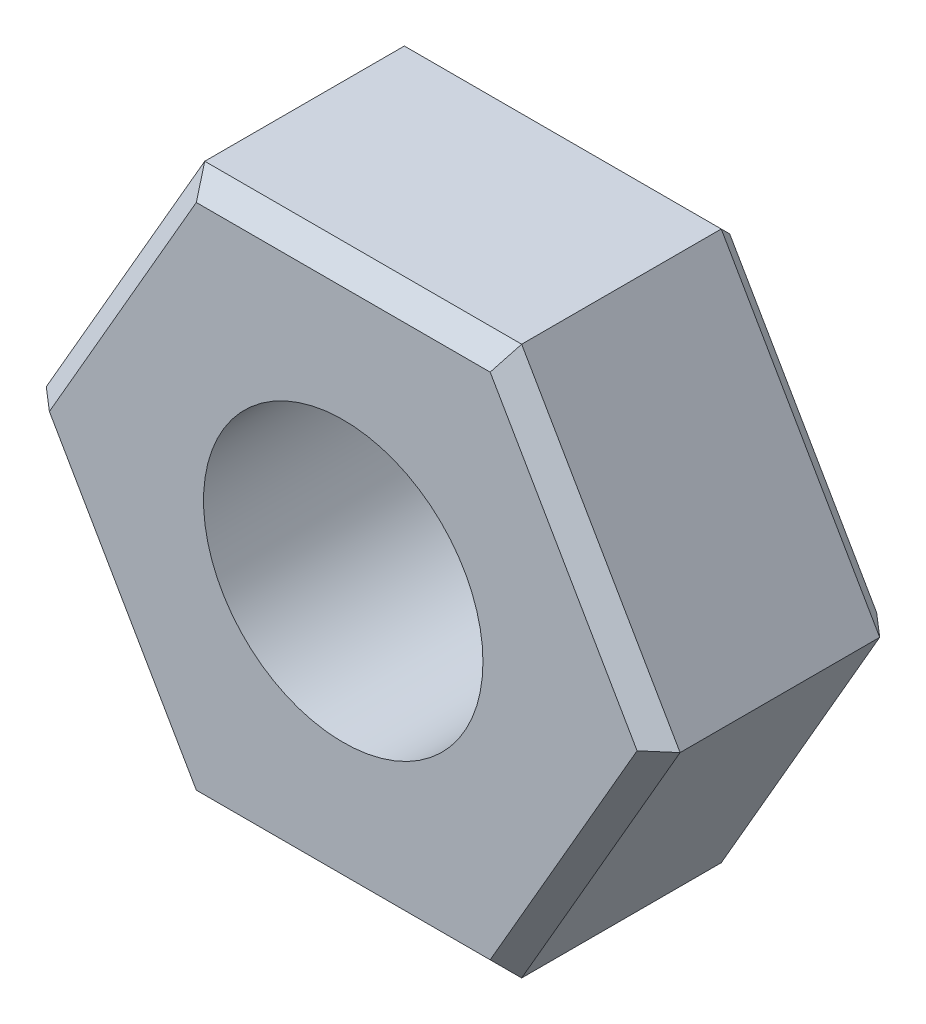
ISO-10303-21;
HEADER;
FILE_DESCRIPTION(('STEP AP214'),'2;1');
FILE_NAME('part.step','',(''),(''),'','','');
FILE_SCHEMA(('AUTOMOTIVE_DESIGN { 1 0 10303 214 1 1 1 1 }'));
ENDSEC;
DATA;
#1=APPLICATION_CONTEXT('core data for automotive mechanical design processes');
#2=APPLICATION_PROTOCOL_DEFINITION('international standard','automotive_design',2000,#1);
#3=PRODUCT_CONTEXT('',#1,'mechanical');
#4=PRODUCT('Part','Part','',(#3));
#5=PRODUCT_RELATED_PRODUCT_CATEGORY('part','',(#4));
#6=PRODUCT_DEFINITION_FORMATION('','',#4);
#7=PRODUCT_DEFINITION_CONTEXT('part definition',#1,'design');
#8=PRODUCT_DEFINITION('design','',#6,#7);
#9=PRODUCT_DEFINITION_SHAPE('','',#8);
#10=(LENGTH_UNIT() NAMED_UNIT(*) SI_UNIT(.MILLI.,.METRE.));
#11=(NAMED_UNIT(*) PLANE_ANGLE_UNIT() SI_UNIT($,.RADIAN.));
#12=(NAMED_UNIT(*) SI_UNIT($,.STERADIAN.) SOLID_ANGLE_UNIT());
#13=UNCERTAINTY_MEASURE_WITH_UNIT(LENGTH_MEASURE(1.E-05),#10,'distance_accuracy_value','');
#14=(GEOMETRIC_REPRESENTATION_CONTEXT(3) GLOBAL_UNCERTAINTY_ASSIGNED_CONTEXT((#13)) GLOBAL_UNIT_ASSIGNED_CONTEXT((#10,
#11,#12)) REPRESENTATION_CONTEXT('',''));
#15=CARTESIAN_POINT('',(0.,0.,0.));
#16=DIRECTION('',(0.,0.,1.));
#17=DIRECTION('',(1.,0.,0.));
#18=AXIS2_PLACEMENT_3D('',#15,#16,#17);
#19=CARTESIAN_POINT('',(1.5877132402715,-2.74999999999998,-2.4));
#20=DIRECTION('',(-0.866025403784441,0.499999999999995,0.));
#21=DIRECTION('',(-0.499999999999995,-0.866025403784441,0.));
#22=AXIS2_PLACEMENT_3D('',#19,#20,#21);
#23=PLANE('',#22);
#24=DIRECTION('',(0.,0.,1.));
#25=VECTOR('',#24,1.);
#26=CARTESIAN_POINT('',(1.5877132402715,-2.74999999999998,-2.4));
#27=LINE('',#26,#25);
#28=CARTESIAN_POINT('',(1.5877132402715,-2.74999999999998,-2.2));
#29=VERTEX_POINT('',#28);
#30=CARTESIAN_POINT('',(1.5877132402715,-2.74999999999998,-0.200000000000002));
#31=VERTEX_POINT('',#30);
#32=EDGE_CURVE('E160',#29,#31,#27,.T.);
#33=ORIENTED_EDGE('',*,*,#32,.F.);
#34=DIRECTION('',(-0.499999999999995,-0.866025403784441,0.));
#35=VECTOR('',#34,1.);
#36=CARTESIAN_POINT('',(1.5877132402715,-2.74999999999998,-2.2));
#37=LINE('',#36,#35);
#38=CARTESIAN_POINT('',(3.17542648054294,0.,-2.2));
#39=VERTEX_POINT('',#38);
#40=EDGE_CURVE('E133',#39,#29,#37,.T.);
#41=ORIENTED_EDGE('',*,*,#40,.F.);
#42=DIRECTION('',(0.,0.,1.));
#43=VECTOR('',#42,1.);
#44=CARTESIAN_POINT('',(3.17542648054294,0.,-2.4));
#45=LINE('',#44,#43);
#46=CARTESIAN_POINT('',(3.17542648054294,0.,-0.200000000000002));
#47=VERTEX_POINT('',#46);
#48=EDGE_CURVE('E151',#39,#47,#45,.T.);
#49=ORIENTED_EDGE('',*,*,#48,.T.);
#50=DIRECTION('',(0.499999999999995,0.866025403784441,0.));
#51=VECTOR('',#50,1.);
#52=CARTESIAN_POINT('',(1.5877132402715,-2.74999999999998,-0.200000000000002));
#53=LINE('',#52,#51);
#54=EDGE_CURVE('E161',#31,#47,#53,.T.);
#55=ORIENTED_EDGE('',*,*,#54,.F.);
#56=EDGE_LOOP('',(#33,#41,#49,#55));
#57=FACE_BOUND('',#56,.T.);
#58=ADVANCED_FACE('F41',(#57),#23,.F.);
#59=CARTESIAN_POINT('',(3.17542648054294,0.,-2.4));
#60=DIRECTION('',(-0.866025403784438,-0.500000000000001,0.));
#61=DIRECTION('',(0.500000000000001,-0.866025403784438,0.));
#62=AXIS2_PLACEMENT_3D('',#59,#60,#61);
#63=PLANE('',#62);
#64=ORIENTED_EDGE('',*,*,#48,.F.);
#65=DIRECTION('',(0.500000000000001,-0.866025403784438,0.));
#66=VECTOR('',#65,1.);
#67=CARTESIAN_POINT('',(3.17542648054294,0.,-2.2));
#68=LINE('',#67,#66);
#69=CARTESIAN_POINT('',(1.58771324027146,2.75,-2.2));
#70=VERTEX_POINT('',#69);
#71=EDGE_CURVE('E141',#70,#39,#68,.T.);
#72=ORIENTED_EDGE('',*,*,#71,.F.);
#73=DIRECTION('',(0.,0.,1.));
#74=VECTOR('',#73,1.);
#75=CARTESIAN_POINT('',(1.58771324027146,2.75,-2.4));
#76=LINE('',#75,#74);
#77=CARTESIAN_POINT('',(1.58771324027146,2.75,-0.200000000000002));
#78=VERTEX_POINT('',#77);
#79=EDGE_CURVE('E157',#70,#78,#76,.T.);
#80=ORIENTED_EDGE('',*,*,#79,.T.);
#81=DIRECTION('',(-0.500000000000001,0.866025403784438,0.));
#82=VECTOR('',#81,1.);
#83=CARTESIAN_POINT('',(3.17542648054294,0.,-0.200000000000002));
#84=LINE('',#83,#82);
#85=EDGE_CURVE('E146',#47,#78,#84,.T.);
#86=ORIENTED_EDGE('',*,*,#85,.F.);
#87=EDGE_LOOP('',(#64,#72,#80,#86));
#88=FACE_BOUND('',#87,.T.);
#89=ADVANCED_FACE('F152',(#88),#63,.F.);
#90=CARTESIAN_POINT('',(1.58771324027146,2.75,-2.4));
#91=DIRECTION('',(0.,-1.,0.));
#92=DIRECTION('',(1.,0.,0.));
#93=AXIS2_PLACEMENT_3D('',#90,#91,#92);
#94=PLANE('',#93);
#95=ORIENTED_EDGE('',*,*,#79,.F.);
#96=DIRECTION('',(1.,0.,0.));
#97=VECTOR('',#96,1.);
#98=CARTESIAN_POINT('',(1.58771324027146,2.75,-2.2));
#99=LINE('',#98,#97);
#100=CARTESIAN_POINT('',(-1.58771324027148,2.74999999999999,-2.2));
#101=VERTEX_POINT('',#100);
#102=EDGE_CURVE('E184',#101,#70,#99,.T.);
#103=ORIENTED_EDGE('',*,*,#102,.F.);
#104=DIRECTION('',(0.,0.,1.));
#105=VECTOR('',#104,1.);
#106=CARTESIAN_POINT('',(-1.58771324027148,2.74999999999999,-2.4));
#107=LINE('',#106,#105);
#108=CARTESIAN_POINT('',(-1.58771324027148,2.74999999999999,-0.200000000000002));
#109=VERTEX_POINT('',#108);
#110=EDGE_CURVE('E252',#101,#109,#107,.T.);
#111=ORIENTED_EDGE('',*,*,#110,.T.);
#112=DIRECTION('',(-1.,0.,0.));
#113=VECTOR('',#112,1.);
#114=CARTESIAN_POINT('',(1.58771324027146,2.75,-0.200000000000002));
#115=LINE('',#114,#113);
#116=EDGE_CURVE('E186',#78,#109,#115,.T.);
#117=ORIENTED_EDGE('',*,*,#116,.F.);
#118=EDGE_LOOP('',(#95,#103,#111,#117));
#119=FACE_BOUND('',#118,.T.);
#120=ADVANCED_FACE('F262',(#119),#94,.F.);
#121=CARTESIAN_POINT('',(-1.58771324027148,2.74999999999999,-2.4));
#122=DIRECTION('',(0.866025403784441,-0.499999999999995,0.));
#123=DIRECTION('',(0.499999999999995,0.866025403784442,0.));
#124=AXIS2_PLACEMENT_3D('',#121,#122,#123);
#125=PLANE('',#124);
#126=ORIENTED_EDGE('',*,*,#110,.F.);
#127=DIRECTION('',(0.499999999999995,0.866025403784442,0.));
#128=VECTOR('',#127,1.);
#129=CARTESIAN_POINT('',(-1.58771324027148,2.74999999999999,-2.2));
#130=LINE('',#129,#128);
#131=CARTESIAN_POINT('',(-3.17542648054294,0.,-2.2));
#132=VERTEX_POINT('',#131);
#133=EDGE_CURVE('E189',#132,#101,#130,.T.);
#134=ORIENTED_EDGE('',*,*,#133,.F.);
#135=DIRECTION('',(0.,0.,1.));
#136=VECTOR('',#135,1.);
#137=CARTESIAN_POINT('',(-3.17542648054294,0.,-2.4));
#138=LINE('',#137,#136);
#139=CARTESIAN_POINT('',(-3.17542648054294,0.,-0.200000000000002));
#140=VERTEX_POINT('',#139);
#141=EDGE_CURVE('E248',#132,#140,#138,.T.);
#142=ORIENTED_EDGE('',*,*,#141,.T.);
#143=DIRECTION('',(-0.499999999999995,-0.866025403784442,0.));
#144=VECTOR('',#143,1.);
#145=CARTESIAN_POINT('',(-1.58771324027148,2.74999999999999,-0.200000000000002));
#146=LINE('',#145,#144);
#147=EDGE_CURVE('E192',#109,#140,#146,.T.);
#148=ORIENTED_EDGE('',*,*,#147,.F.);
#149=EDGE_LOOP('',(#126,#134,#142,#148));
#150=FACE_BOUND('',#149,.T.);
#151=ADVANCED_FACE('F255',(#150),#125,.F.);
#152=CARTESIAN_POINT('',(-3.17542648054294,0.,-2.4));
#153=DIRECTION('',(0.866025403784434,0.500000000000007,0.));
#154=DIRECTION('',(-0.500000000000007,0.866025403784435,0.));
#155=AXIS2_PLACEMENT_3D('',#152,#153,#154);
#156=PLANE('',#155);
#157=ORIENTED_EDGE('',*,*,#141,.F.);
#158=DIRECTION('',(-0.500000000000007,0.866025403784435,0.));
#159=VECTOR('',#158,1.);
#160=CARTESIAN_POINT('',(-3.17542648054294,0.,-2.2));
#161=LINE('',#160,#159);
#162=CARTESIAN_POINT('',(-1.58771324027145,-2.75000000000001,-2.2));
#163=VERTEX_POINT('',#162);
#164=EDGE_CURVE('E195',#163,#132,#161,.T.);
#165=ORIENTED_EDGE('',*,*,#164,.F.);
#166=DIRECTION('',(0.,0.,1.));
#167=VECTOR('',#166,1.);
#168=CARTESIAN_POINT('',(-1.58771324027145,-2.75000000000001,-2.4));
#169=LINE('',#168,#167);
#170=CARTESIAN_POINT('',(-1.58771324027145,-2.75000000000001,-0.200000000000002));
#171=VERTEX_POINT('',#170);
#172=EDGE_CURVE('E253',#163,#171,#169,.T.);
#173=ORIENTED_EDGE('',*,*,#172,.T.);
#174=DIRECTION('',(0.500000000000007,-0.866025403784435,0.));
#175=VECTOR('',#174,1.);
#176=CARTESIAN_POINT('',(-3.17542648054294,0.,-0.200000000000002));
#177=LINE('',#176,#175);
#178=EDGE_CURVE('E198',#140,#171,#177,.T.);
#179=ORIENTED_EDGE('',*,*,#178,.F.);
#180=EDGE_LOOP('',(#157,#165,#173,#179));
#181=FACE_BOUND('',#180,.T.);
#182=ADVANCED_FACE('F249',(#181),#156,.F.);
#183=CARTESIAN_POINT('',(-1.58771324027145,-2.75000000000001,-2.4));
#184=DIRECTION('',(0.,1.,0.));
#185=DIRECTION('',(-1.,0.,0.));
#186=AXIS2_PLACEMENT_3D('',#183,#184,#185);
#187=PLANE('',#186);
#188=ORIENTED_EDGE('',*,*,#172,.F.);
#189=DIRECTION('',(-1.,0.,0.));
#190=VECTOR('',#189,1.);
#191=CARTESIAN_POINT('',(-1.58771324027145,-2.75000000000001,-2.2));
#192=LINE('',#191,#190);
#193=EDGE_CURVE('E201',#29,#163,#192,.T.);
#194=ORIENTED_EDGE('',*,*,#193,.F.);
#195=ORIENTED_EDGE('',*,*,#32,.T.);
#196=DIRECTION('',(1.,0.,0.));
#197=VECTOR('',#196,1.);
#198=CARTESIAN_POINT('',(-1.58771324027145,-2.75000000000001,-0.200000000000002));
#199=LINE('',#198,#197);
#200=EDGE_CURVE('E204',#171,#31,#199,.T.);
#201=ORIENTED_EDGE('',*,*,#200,.F.);
#202=EDGE_LOOP('',(#188,#194,#195,#201));
#203=FACE_BOUND('',#202,.T.);
#204=ADVANCED_FACE('F274',(#203),#187,.F.);
#205=CARTESIAN_POINT('',(0.,0.,-2.4));
#206=DIRECTION('',(0.,0.,-1.));
#207=DIRECTION('',(1.,0.,0.));
#208=AXIS2_PLACEMENT_3D('',#205,#206,#207);
#209=PLANE('',#208);
#210=CARTESIAN_POINT('',(0.,0.,-2.4));
#211=DIRECTION('',(0.,0.,1.));
#212=DIRECTION('',(1.,0.,0.));
#213=AXIS2_PLACEMENT_3D('',#210,#211,#212);
#214=CIRCLE('',#213,1.4);
#215=CARTESIAN_POINT('',(1.4,0.,-2.4));
#216=VERTEX_POINT('',#215);
#217=EDGE_CURVE('E138',#216,#216,#214,.T.);
#218=ORIENTED_EDGE('',*,*,#217,.T.);
#219=EDGE_LOOP('',(#218));
#220=FACE_BOUND('',#219,.T.);
#221=DIRECTION('',(1.,0.,0.));
#222=VECTOR('',#221,1.);
#223=CARTESIAN_POINT('',(1.5877132402715,-2.54999999999998,-2.4));
#224=LINE('',#223,#222);
#225=CARTESIAN_POINT('',(-1.47224318643352,-2.55000000000001,-2.4));
#226=VERTEX_POINT('',#225);
#227=CARTESIAN_POINT('',(1.47224318643358,-2.54999999999998,-2.4));
#228=VERTEX_POINT('',#227);
#229=EDGE_CURVE('E207',#226,#228,#224,.T.);
#230=ORIENTED_EDGE('',*,*,#229,.F.);
#231=DIRECTION('',(0.500000000000007,-0.866025403784435,0.));
#232=VECTOR('',#231,1.);
#233=CARTESIAN_POINT('',(-1.41450815951456,-2.65000000000001,-2.4));
#234=LINE('',#233,#232);
#235=CARTESIAN_POINT('',(-2.94448637286709,0.,-2.4));
#236=VERTEX_POINT('',#235);
#237=EDGE_CURVE('E210',#236,#226,#234,.T.);
#238=ORIENTED_EDGE('',*,*,#237,.F.);
#239=DIRECTION('',(-0.499999999999995,-0.866025403784442,0.));
#240=VECTOR('',#239,1.);
#241=CARTESIAN_POINT('',(-3.00222139978605,-0.100000000000022,-2.4));
#242=LINE('',#241,#240);
#243=CARTESIAN_POINT('',(-1.47224318643356,2.54999999999999,-2.4));
#244=VERTEX_POINT('',#243);
#245=EDGE_CURVE('E213',#244,#236,#242,.T.);
#246=ORIENTED_EDGE('',*,*,#245,.F.);
#247=DIRECTION('',(-1.,0.,0.));
#248=VECTOR('',#247,1.);
#249=CARTESIAN_POINT('',(-1.58771324027148,2.54999999999999,-2.4));
#250=LINE('',#249,#248);
#251=CARTESIAN_POINT('',(1.47224318643354,2.55,-2.4));
#252=VERTEX_POINT('',#251);
#253=EDGE_CURVE('E216',#252,#244,#250,.T.);
#254=ORIENTED_EDGE('',*,*,#253,.F.);
#255=DIRECTION('',(-0.500000000000001,0.866025403784438,0.));
#256=VECTOR('',#255,1.);
#257=CARTESIAN_POINT('',(1.41450815951458,2.65,-2.4));
#258=LINE('',#257,#256);
#259=CARTESIAN_POINT('',(2.94448637286709,0.,-2.4));
#260=VERTEX_POINT('',#259);
#261=EDGE_CURVE('E50',#260,#252,#258,.T.);
#262=ORIENTED_EDGE('',*,*,#261,.F.);
#263=DIRECTION('',(0.499999999999995,0.866025403784441,0.));
#264=VECTOR('',#263,1.);
#265=CARTESIAN_POINT('',(3.00222139978605,0.0999999999999995,-2.4));
#266=LINE('',#265,#264);
#267=EDGE_CURVE('E11',#228,#260,#266,.T.);
#268=ORIENTED_EDGE('',*,*,#267,.F.);
#269=EDGE_LOOP('',(#230,#238,#246,#254,#262,#268));
#270=FACE_BOUND('',#269,.T.);
#271=ADVANCED_FACE('F267',(#220,#270),#209,.T.);
#272=CARTESIAN_POINT('',(0.,0.,0.));
#273=DIRECTION('',(0.,0.,-1.));
#274=DIRECTION('',(1.,0.,0.));
#275=AXIS2_PLACEMENT_3D('',#272,#273,#274);
#276=PLANE('',#275);
#277=CARTESIAN_POINT('',(0.,0.,0.));
#278=DIRECTION('',(0.,0.,1.));
#279=DIRECTION('',(1.,0.,0.));
#280=AXIS2_PLACEMENT_3D('',#277,#278,#279);
#281=CIRCLE('',#280,1.4);
#282=CARTESIAN_POINT('',(1.4,0.,0.));
#283=VERTEX_POINT('',#282);
#284=EDGE_CURVE('E278',#283,#283,#281,.T.);
#285=ORIENTED_EDGE('',*,*,#284,.F.);
#286=EDGE_LOOP('',(#285));
#287=FACE_BOUND('',#286,.T.);
#288=DIRECTION('',(0.500000000000001,-0.866025403784438,0.));
#289=VECTOR('',#288,1.);
#290=CARTESIAN_POINT('',(2.20836477965031,1.275,0.));
#291=LINE('',#290,#289);
#292=CARTESIAN_POINT('',(1.47224318643354,2.55,0.));
#293=VERTEX_POINT('',#292);
#294=CARTESIAN_POINT('',(2.94448637286709,0.,0.));
#295=VERTEX_POINT('',#294);
#296=EDGE_CURVE('E178',#293,#295,#291,.T.);
#297=ORIENTED_EDGE('',*,*,#296,.F.);
#298=DIRECTION('',(1.,0.,0.));
#299=VECTOR('',#298,1.);
#300=CARTESIAN_POINT('',(0.,2.55,0.));
#301=LINE('',#300,#299);
#302=CARTESIAN_POINT('',(-1.47224318643356,2.54999999999999,0.));
#303=VERTEX_POINT('',#302);
#304=EDGE_CURVE('E175',#303,#293,#301,.T.);
#305=ORIENTED_EDGE('',*,*,#304,.F.);
#306=DIRECTION('',(0.499999999999995,0.866025403784442,0.));
#307=VECTOR('',#306,1.);
#308=CARTESIAN_POINT('',(-2.20836477965032,1.27499999999998,0.));
#309=LINE('',#308,#307);
#310=CARTESIAN_POINT('',(-2.94448637286709,0.,0.));
#311=VERTEX_POINT('',#310);
#312=EDGE_CURVE('E172',#311,#303,#309,.T.);
#313=ORIENTED_EDGE('',*,*,#312,.F.);
#314=DIRECTION('',(-0.500000000000007,0.866025403784435,0.));
#315=VECTOR('',#314,1.);
#316=CARTESIAN_POINT('',(-2.20836477965031,-1.27500000000002,0.));
#317=LINE('',#316,#315);
#318=CARTESIAN_POINT('',(-1.47224318643352,-2.55000000000001,0.));
#319=VERTEX_POINT('',#318);
#320=EDGE_CURVE('E169',#319,#311,#317,.T.);
#321=ORIENTED_EDGE('',*,*,#320,.F.);
#322=DIRECTION('',(-1.,0.,0.));
#323=VECTOR('',#322,1.);
#324=CARTESIAN_POINT('',(0.,-2.55,0.));
#325=LINE('',#324,#323);
#326=CARTESIAN_POINT('',(1.47224318643358,-2.54999999999998,0.));
#327=VERTEX_POINT('',#326);
#328=EDGE_CURVE('E163',#327,#319,#325,.T.);
#329=ORIENTED_EDGE('',*,*,#328,.F.);
#330=DIRECTION('',(-0.499999999999995,-0.866025403784441,0.));
#331=VECTOR('',#330,1.);
#332=CARTESIAN_POINT('',(2.20836477965033,-1.27499999999999,0.));
#333=LINE('',#332,#331);
#334=EDGE_CURVE('E147',#295,#327,#333,.T.);
#335=ORIENTED_EDGE('',*,*,#334,.F.);
#336=EDGE_LOOP('',(#297,#305,#313,#321,#329,#335));
#337=FACE_BOUND('',#336,.T.);
#338=ADVANCED_FACE('F291',(#287,#337),#276,.F.);
#339=CARTESIAN_POINT('',(-1.58771324027148,2.74999999999999,-0.200000000000002));
#340=DIRECTION('',(0.612372435695798,-0.353553390593271,-0.707106781186547));
#341=DIRECTION('',(-0.499999999999995,-0.866025403784442,0.));
#342=AXIS2_PLACEMENT_3D('',#339,#340,#341);
#343=PLANE('',#342);
#344=DIRECTION('',(0.377964473009231,-0.654653670707974,0.654653670707978));
#345=VECTOR('',#344,1.);
#346=CARTESIAN_POINT('',(-1.58771324027148,2.74999999999999,-0.200000000000002));
#347=LINE('',#346,#345);
#348=EDGE_CURVE('E227',#303,#109,#347,.F.);
#349=ORIENTED_EDGE('',*,*,#348,.T.);
#350=ORIENTED_EDGE('',*,*,#147,.T.);
#351=DIRECTION('',(0.755928946018453,0.,0.654653670707979));
#352=VECTOR('',#351,1.);
#353=CARTESIAN_POINT('',(-3.17542648054294,0.,-0.200000000000002));
#354=LINE('',#353,#352);
#355=EDGE_CURVE('E229',#140,#311,#354,.T.);
#356=ORIENTED_EDGE('',*,*,#355,.T.);
#357=ORIENTED_EDGE('',*,*,#312,.T.);
#358=EDGE_LOOP('',(#349,#350,#356,#357));
#359=FACE_BOUND('',#358,.T.);
#360=ADVANCED_FACE('F294',(#359),#343,.F.);
#361=CARTESIAN_POINT('',(-3.17542648054294,0.,-0.200000000000002));
#362=DIRECTION('',(0.612372435695793,0.35355339059328,-0.707106781186545));
#363=DIRECTION('',(0.500000000000007,-0.866025403784435,0.));
#364=AXIS2_PLACEMENT_3D('',#361,#362,#363);
#365=PLANE('',#364);
#366=ORIENTED_EDGE('',*,*,#355,.F.);
#367=ORIENTED_EDGE('',*,*,#178,.T.);
#368=DIRECTION('',(0.377964473009219,0.65465367070798,0.654653670707979));
#369=VECTOR('',#368,1.);
#370=CARTESIAN_POINT('',(-1.58771324027145,-2.75000000000001,-0.200000000000002));
#371=LINE('',#370,#369);
#372=EDGE_CURVE('E225',#171,#319,#371,.T.);
#373=ORIENTED_EDGE('',*,*,#372,.T.);
#374=ORIENTED_EDGE('',*,*,#320,.T.);
#375=EDGE_LOOP('',(#366,#367,#373,#374));
#376=FACE_BOUND('',#375,.T.);
#377=ADVANCED_FACE('F308',(#376),#365,.F.);
#378=CARTESIAN_POINT('',(1.58771324027146,2.75,-0.200000000000002));
#379=DIRECTION('',(0.,-0.707106781186549,-0.707106781186546));
#380=DIRECTION('',(-1.,0.,0.));
#381=AXIS2_PLACEMENT_3D('',#378,#379,#380);
#382=PLANE('',#381);
#383=ORIENTED_EDGE('',*,*,#348,.F.);
#384=ORIENTED_EDGE('',*,*,#304,.T.);
#385=DIRECTION('',(-0.377964473009224,-0.654653670707977,0.654653670707979));
#386=VECTOR('',#385,1.);
#387=CARTESIAN_POINT('',(1.58771324027146,2.75,-0.200000000000002));
#388=LINE('',#387,#386);
#389=EDGE_CURVE('E223',#293,#78,#388,.F.);
#390=ORIENTED_EDGE('',*,*,#389,.T.);
#391=ORIENTED_EDGE('',*,*,#116,.T.);
#392=EDGE_LOOP('',(#383,#384,#390,#391));
#393=FACE_BOUND('',#392,.T.);
#394=ADVANCED_FACE('F304',(#393),#382,.F.);
#395=CARTESIAN_POINT('',(-1.58771324027145,-2.75000000000001,-0.200000000000002));
#396=DIRECTION('',(0.,0.707106781186549,-0.707106781186546));
#397=DIRECTION('',(1.,0.,0.));
#398=AXIS2_PLACEMENT_3D('',#395,#396,#397);
#399=PLANE('',#398);
#400=ORIENTED_EDGE('',*,*,#372,.F.);
#401=ORIENTED_EDGE('',*,*,#200,.T.);
#402=DIRECTION('',(0.377964473009231,-0.654653670707973,-0.654653670707979));
#403=VECTOR('',#402,1.);
#404=CARTESIAN_POINT('',(1.13408088590822,-1.96428571428571,0.585714285714282));
#405=LINE('',#404,#403);
#406=EDGE_CURVE('E221',#31,#327,#405,.F.);
#407=ORIENTED_EDGE('',*,*,#406,.T.);
#408=ORIENTED_EDGE('',*,*,#328,.T.);
#409=EDGE_LOOP('',(#400,#401,#407,#408));
#410=FACE_BOUND('',#409,.T.);
#411=ADVANCED_FACE('F310',(#410),#399,.F.);
#412=CARTESIAN_POINT('',(3.17542648054294,0.,-0.200000000000002));
#413=DIRECTION('',(-0.612372435695796,-0.353553390593276,-0.707106781186545));
#414=DIRECTION('',(-0.500000000000001,0.866025403784438,0.));
#415=AXIS2_PLACEMENT_3D('',#412,#413,#414);
#416=PLANE('',#415);
#417=ORIENTED_EDGE('',*,*,#389,.F.);
#418=ORIENTED_EDGE('',*,*,#296,.T.);
#419=DIRECTION('',(-0.755928946018452,0.,0.65465367070798));
#420=VECTOR('',#419,1.);
#421=CARTESIAN_POINT('',(3.17542648054294,0.,-0.200000000000002));
#422=LINE('',#421,#420);
#423=EDGE_CURVE('E219',#295,#47,#422,.F.);
#424=ORIENTED_EDGE('',*,*,#423,.T.);
#425=ORIENTED_EDGE('',*,*,#85,.T.);
#426=EDGE_LOOP('',(#417,#418,#424,#425));
#427=FACE_BOUND('',#426,.T.);
#428=ADVANCED_FACE('F302',(#427),#416,.F.);
#429=CARTESIAN_POINT('',(1.5877132402715,-2.74999999999998,-0.200000000000002));
#430=DIRECTION('',(-0.612372435695798,0.353553390593271,-0.707106781186546));
#431=DIRECTION('',(0.499999999999995,0.866025403784441,0.));
#432=AXIS2_PLACEMENT_3D('',#429,#430,#431);
#433=PLANE('',#432);
#434=ORIENTED_EDGE('',*,*,#406,.F.);
#435=ORIENTED_EDGE('',*,*,#54,.T.);
#436=ORIENTED_EDGE('',*,*,#423,.F.);
#437=ORIENTED_EDGE('',*,*,#334,.T.);
#438=EDGE_LOOP('',(#434,#435,#436,#437));
#439=FACE_BOUND('',#438,.T.);
#440=ADVANCED_FACE('F312',(#439),#433,.F.);
#441=CARTESIAN_POINT('',(-2.20836477965032,1.27499999999999,-2.4));
#442=DIRECTION('',(-0.612372435695796,0.35355339059327,-0.707106781186548));
#443=DIRECTION('',(0.499999999999995,0.866025403784442,0.));
#444=AXIS2_PLACEMENT_3D('',#441,#442,#443);
#445=PLANE('',#444);
#446=DIRECTION('',(-0.377964473009231,0.654653670707975,0.654653670707977));
#447=VECTOR('',#446,1.);
#448=CARTESIAN_POINT('',(-1.26192273122876,2.18571428571428,-2.76428571428571));
#449=LINE('',#448,#447);
#450=EDGE_CURVE('E234',#101,#244,#449,.F.);
#451=ORIENTED_EDGE('',*,*,#450,.T.);
#452=ORIENTED_EDGE('',*,*,#245,.T.);
#453=DIRECTION('',(-0.755928946018455,0.,0.654653670707977));
#454=VECTOR('',#453,1.);
#455=CARTESIAN_POINT('',(-2.5238454624575,0.,-2.76428571428572));
#456=LINE('',#455,#454);
#457=EDGE_CURVE('E45',#236,#132,#456,.T.);
#458=ORIENTED_EDGE('',*,*,#457,.T.);
#459=ORIENTED_EDGE('',*,*,#133,.T.);
#460=EDGE_LOOP('',(#451,#452,#458,#459));
#461=FACE_BOUND('',#460,.T.);
#462=ADVANCED_FACE('F43',(#461),#445,.T.);
#463=CARTESIAN_POINT('',(-2.20836477965031,-1.27500000000002,-2.4));
#464=DIRECTION('',(-0.612372435695792,-0.353553390593279,-0.707106781186547));
#465=DIRECTION('',(-0.500000000000007,0.866025403784435,0.));
#466=AXIS2_PLACEMENT_3D('',#463,#464,#465);
#467=PLANE('',#466);
#468=ORIENTED_EDGE('',*,*,#457,.F.);
#469=ORIENTED_EDGE('',*,*,#237,.T.);
#470=DIRECTION('',(-0.37796447300922,-0.654653670707981,0.654653670707977));
#471=VECTOR('',#470,1.);
#472=CARTESIAN_POINT('',(-1.26192273122873,-2.18571428571429,-2.76428571428571));
#473=LINE('',#472,#471);
#474=EDGE_CURVE('E233',#226,#163,#473,.T.);
#475=ORIENTED_EDGE('',*,*,#474,.T.);
#476=ORIENTED_EDGE('',*,*,#164,.T.);
#477=EDGE_LOOP('',(#468,#469,#475,#476));
#478=FACE_BOUND('',#477,.T.);
#479=ADVANCED_FACE('F243',(#478),#467,.T.);
#480=CARTESIAN_POINT('',(0.,2.55,-2.4));
#481=DIRECTION('',(0.,0.707106781186547,-0.707106781186547));
#482=DIRECTION('',(1.,0.,0.));
#483=AXIS2_PLACEMENT_3D('',#480,#481,#482);
#484=PLANE('',#483);
#485=ORIENTED_EDGE('',*,*,#450,.F.);
#486=ORIENTED_EDGE('',*,*,#102,.T.);
#487=DIRECTION('',(0.377964473009225,0.654653670707978,0.654653670707977));
#488=VECTOR('',#487,1.);
#489=CARTESIAN_POINT('',(1.26192273122875,2.18571428571429,-2.76428571428571));
#490=LINE('',#489,#488);
#491=EDGE_CURVE('E65',#70,#252,#490,.F.);
#492=ORIENTED_EDGE('',*,*,#491,.T.);
#493=ORIENTED_EDGE('',*,*,#253,.T.);
#494=EDGE_LOOP('',(#485,#486,#492,#493));
#495=FACE_BOUND('',#494,.T.);
#496=ADVANCED_FACE('F263',(#495),#484,.T.);
#497=CARTESIAN_POINT('',(0.,-2.55,-2.4));
#498=DIRECTION('',(0.,-0.707106781186547,-0.707106781186547));
#499=DIRECTION('',(-1.,0.,0.));
#500=AXIS2_PLACEMENT_3D('',#497,#498,#499);
#501=PLANE('',#500);
#502=ORIENTED_EDGE('',*,*,#474,.F.);
#503=ORIENTED_EDGE('',*,*,#229,.T.);
#504=DIRECTION('',(-0.377964473009231,0.654653670707974,-0.654653670707978));
#505=VECTOR('',#504,1.);
#506=CARTESIAN_POINT('',(1.26192273122878,-2.18571428571427,-2.76428571428571));
#507=LINE('',#506,#505);
#508=EDGE_CURVE('E137',#228,#29,#507,.F.);
#509=ORIENTED_EDGE('',*,*,#508,.T.);
#510=ORIENTED_EDGE('',*,*,#193,.T.);
#511=EDGE_LOOP('',(#502,#503,#509,#510));
#512=FACE_BOUND('',#511,.T.);
#513=ADVANCED_FACE('F269',(#512),#501,.T.);
#514=CARTESIAN_POINT('',(2.20836477965031,1.275,-2.4));
#515=DIRECTION('',(0.612372435695795,0.353553390593275,-0.707106781186547));
#516=DIRECTION('',(0.500000000000001,-0.866025403784438,0.));
#517=AXIS2_PLACEMENT_3D('',#514,#515,#516);
#518=PLANE('',#517);
#519=ORIENTED_EDGE('',*,*,#491,.F.);
#520=ORIENTED_EDGE('',*,*,#71,.T.);
#521=DIRECTION('',(0.755928946018454,0.,0.654653670707978));
#522=VECTOR('',#521,1.);
#523=CARTESIAN_POINT('',(2.52384546245751,0.,-2.76428571428571));
#524=LINE('',#523,#522);
#525=EDGE_CURVE('E58',#39,#260,#524,.F.);
#526=ORIENTED_EDGE('',*,*,#525,.T.);
#527=ORIENTED_EDGE('',*,*,#261,.T.);
#528=EDGE_LOOP('',(#519,#520,#526,#527));
#529=FACE_BOUND('',#528,.T.);
#530=ADVANCED_FACE('F143',(#529),#518,.T.);
#531=CARTESIAN_POINT('',(2.20836477965033,-1.27499999999999,-2.4));
#532=DIRECTION('',(0.612372435695797,-0.353553390593271,-0.707106781186547));
#533=DIRECTION('',(-0.499999999999995,-0.866025403784441,0.));
#534=AXIS2_PLACEMENT_3D('',#531,#532,#533);
#535=PLANE('',#534);
#536=ORIENTED_EDGE('',*,*,#508,.F.);
#537=ORIENTED_EDGE('',*,*,#267,.T.);
#538=ORIENTED_EDGE('',*,*,#525,.F.);
#539=ORIENTED_EDGE('',*,*,#40,.T.);
#540=EDGE_LOOP('',(#536,#537,#538,#539));
#541=FACE_BOUND('',#540,.T.);
#542=ADVANCED_FACE('F131',(#541),#535,.T.);
#543=CARTESIAN_POINT('',(0.,0.,-2.4));
#544=DIRECTION('',(0.,0.,1.));
#545=DIRECTION('',(-1.,0.,0.));
#546=AXIS2_PLACEMENT_3D('',#543,#544,#545);
#547=CYLINDRICAL_SURFACE('',#546,1.4);
#548=ORIENTED_EDGE('',*,*,#217,.F.);
#549=EDGE_LOOP('',(#548));
#550=FACE_BOUND('',#549,.T.);
#551=ORIENTED_EDGE('',*,*,#284,.T.);
#552=EDGE_LOOP('',(#551));
#553=FACE_BOUND('',#552,.T.);
#554=ADVANCED_FACE('F285',(#550,#553),#547,.F.);
#555=CLOSED_SHELL('',(#58,#89,#120,#151,#182,#204,#271,#338,#360,#377,#394,#411,#428,#440,#462,
#479,#496,#513,#530,#542,#554));
#556=MANIFOLD_SOLID_BREP('B2',#555);
#557=ADVANCED_BREP_SHAPE_REPRESENTATION('',(#18,#556),#14);
#558=SHAPE_DEFINITION_REPRESENTATION(#9,#557);
ENDSEC;
END-ISO-10303-21;
